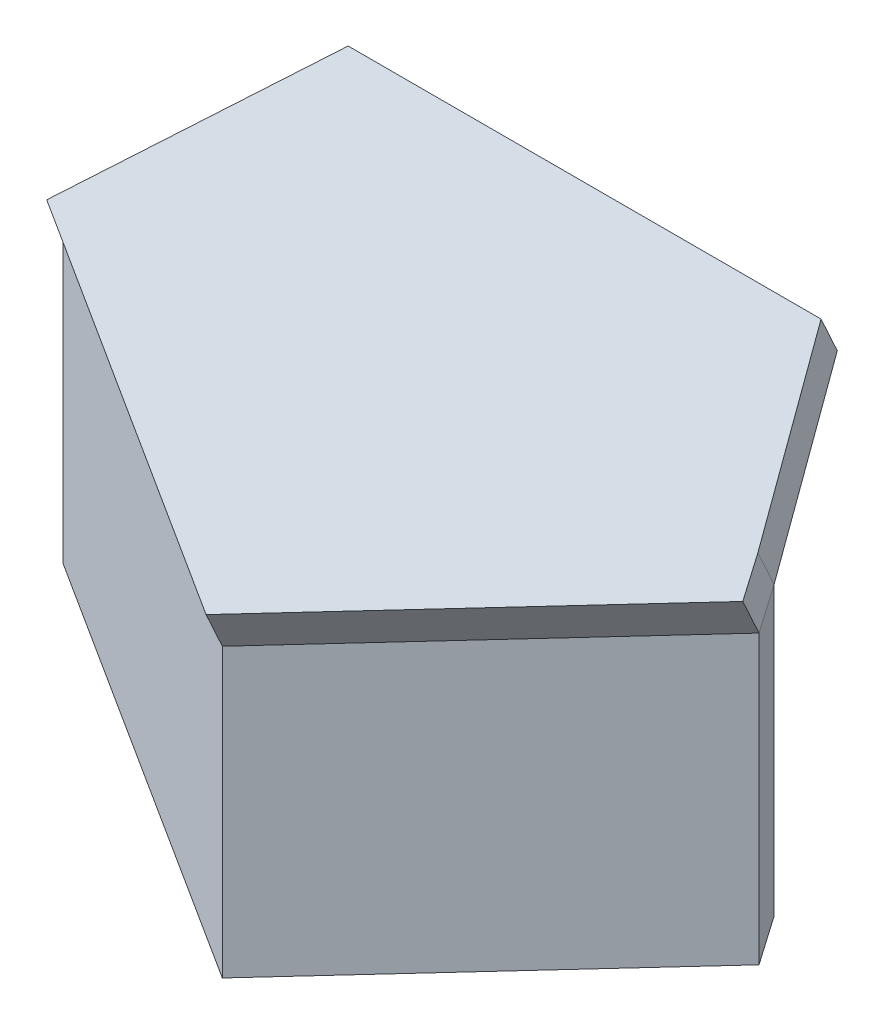
ISO-10303-21;
HEADER;
FILE_DESCRIPTION(('STEP AP214'),'2;1');
FILE_NAME('part.step','',(''),(''),'','','');
FILE_SCHEMA(('AUTOMOTIVE_DESIGN { 1 0 10303 214 1 1 1 1 }'));
ENDSEC;
DATA;
#1=APPLICATION_CONTEXT('core data for automotive mechanical design processes');
#2=APPLICATION_PROTOCOL_DEFINITION('international standard','automotive_design',2000,#1);
#3=PRODUCT_CONTEXT('',#1,'mechanical');
#4=PRODUCT('Part','Part','',(#3));
#5=PRODUCT_RELATED_PRODUCT_CATEGORY('part','',(#4));
#6=PRODUCT_DEFINITION_FORMATION('','',#4);
#7=PRODUCT_DEFINITION_CONTEXT('part definition',#1,'design');
#8=PRODUCT_DEFINITION('design','',#6,#7);
#9=PRODUCT_DEFINITION_SHAPE('','',#8);
#10=(LENGTH_UNIT() NAMED_UNIT(*) SI_UNIT(.MILLI.,.METRE.));
#11=(NAMED_UNIT(*) PLANE_ANGLE_UNIT() SI_UNIT($,.RADIAN.));
#12=(NAMED_UNIT(*) SI_UNIT($,.STERADIAN.) SOLID_ANGLE_UNIT());
#13=UNCERTAINTY_MEASURE_WITH_UNIT(LENGTH_MEASURE(1.E-05),#10,'distance_accuracy_value','');
#14=(GEOMETRIC_REPRESENTATION_CONTEXT(3) GLOBAL_UNCERTAINTY_ASSIGNED_CONTEXT((#13)) GLOBAL_UNIT_ASSIGNED_CONTEXT((#10,
#11,#12)) REPRESENTATION_CONTEXT('',''));
#15=CARTESIAN_POINT('',(0.,0.,0.));
#16=DIRECTION('',(0.,0.,1.));
#17=DIRECTION('',(1.,0.,0.));
#18=AXIS2_PLACEMENT_3D('',#15,#16,#17);
#19=CARTESIAN_POINT('',(4.86882075223607,100.,8.73467712526315));
#20=DIRECTION('',(-0.486882075223607,0.,-0.873467712526315));
#21=DIRECTION('',(-0.873467712526315,0.,0.486882075223607));
#22=AXIS2_PLACEMENT_3D('',#19,#20,#21);
#23=PLANE('',#22);
#24=DIRECTION('',(0.,-1.,0.));
#25=VECTOR('',#24,1.);
#26=CARTESIAN_POINT('',(0.0486636459553036,100.,11.4214943494763));
#27=LINE('',#26,#25);
#28=CARTESIAN_POINT('',(0.0486636459552658,73.5620411776201,11.4214943494763));
#29=VERTEX_POINT('',#28);
#30=CARTESIAN_POINT('',(0.0486636459553036,0.,11.4214943494763));
#31=VERTEX_POINT('',#30);
#32=EDGE_CURVE('E185',#29,#31,#27,.T.);
#33=ORIENTED_EDGE('',*,*,#32,.T.);
#34=DIRECTION('',(0.852663800408745,0.216951466360737,-0.475285708512723));
#35=VECTOR('',#34,1.);
#36=CARTESIAN_POINT('',(23.1406120739026,5.87550693505237,-1.45025306639254));
#37=LINE('',#36,#35);
#38=CARTESIAN_POINT('',(88.285235684222,22.4508812044913,-37.7626995119703));
#39=VERTEX_POINT('',#38);
#40=EDGE_CURVE('E62',#31,#39,#37,.T.);
#41=ORIENTED_EDGE('',*,*,#40,.T.);
#42=DIRECTION('',(0.,-1.,0.));
#43=VECTOR('',#42,1.);
#44=CARTESIAN_POINT('',(88.285235684222,100.,-37.7626995119703));
#45=LINE('',#44,#43);
#46=CARTESIAN_POINT('',(88.285235684222,96.0129223821113,-37.7626995119703));
#47=VERTEX_POINT('',#46);
#48=EDGE_CURVE('E11',#47,#39,#45,.T.);
#49=ORIENTED_EDGE('',*,*,#48,.F.);
#50=DIRECTION('',(-0.852663800408745,-0.216951466360737,0.475285708512723));
#51=VECTOR('',#50,1.);
#52=CARTESIAN_POINT('',(9.53261564042221,75.9751344637524,6.13501820139777));
#53=LINE('',#52,#51);
#54=EDGE_CURVE('E141',#47,#29,#53,.T.);
#55=ORIENTED_EDGE('',*,*,#54,.T.);
#56=EDGE_LOOP('',(#33,#41,#49,#55));
#57=FACE_BOUND('',#56,.T.);
#58=ADVANCED_FACE('F39',(#57),#23,.F.);
#59=CARTESIAN_POINT('',(83.4164149319859,100.,-46.4973766372334));
#60=DIRECTION('',(0.873467712526314,0.,-0.48688207522361));
#61=DIRECTION('',(-0.48688207522361,0.,-0.873467712526314));
#62=AXIS2_PLACEMENT_3D('',#59,#60,#61);
#63=PLANE('',#62);
#64=DIRECTION('',(0.452259904038624,-0.370355663644572,0.811355447140994));
#65=VECTOR('',#64,1.);
#66=CARTESIAN_POINT('',(71.0949924776555,36.5279724392601,-68.6020406491741));
#67=LINE('',#66,#65);
#68=CARTESIAN_POINT('',(83.4164149319859,26.4379588223799,-46.4973766372334));
#69=VERTEX_POINT('',#68);
#70=EDGE_CURVE('E162',#69,#39,#67,.T.);
#71=ORIENTED_EDGE('',*,*,#70,.F.);
#72=DIRECTION('',(0.,-1.,0.));
#73=VECTOR('',#72,1.);
#74=CARTESIAN_POINT('',(83.4164149319859,100.,-46.4973766372334));
#75=LINE('',#74,#73);
#76=CARTESIAN_POINT('',(83.4164149319859,100.,-46.4973766372334));
#77=VERTEX_POINT('',#76);
#78=EDGE_CURVE('E47',#77,#69,#75,.T.);
#79=ORIENTED_EDGE('',*,*,#78,.F.);
#80=DIRECTION('',(-0.452259904038624,0.370355663644572,-0.811355447140994));
#81=VECTOR('',#80,1.);
#82=CARTESIAN_POINT('',(83.4164149319859,100.,-46.4973766372334));
#83=LINE('',#82,#81);
#84=EDGE_CURVE('E180',#47,#77,#83,.T.);
#85=ORIENTED_EDGE('',*,*,#84,.F.);
#86=ORIENTED_EDGE('',*,*,#48,.T.);
#87=EDGE_LOOP('',(#71,#79,#85,#86));
#88=FACE_BOUND('',#87,.T.);
#89=ADVANCED_FACE('F210',(#88),#63,.T.);
#90=CARTESIAN_POINT('',(0.,100.,0.));
#91=DIRECTION('',(-0.486882075223607,0.,-0.873467712526315));
#92=DIRECTION('',(-0.873467712526315,0.,0.486882075223607));
#93=AXIS2_PLACEMENT_3D('',#90,#91,#92);
#94=PLANE('',#93);
#95=DIRECTION('',(0.852663800408745,0.216951466360737,-0.475285708512723));
#96=VECTOR('',#95,1.);
#97=CARTESIAN_POINT('',(17.5342351427504,9.67492102780652,-9.77380694366973));
#98=LINE('',#97,#96);
#99=CARTESIAN_POINT('',(0.,5.21351663382371,0.));
#100=VERTEX_POINT('',#99);
#101=EDGE_CURVE('E159',#100,#69,#98,.T.);
#102=ORIENTED_EDGE('',*,*,#101,.F.);
#103=DIRECTION('',(0.,-1.,0.));
#104=VECTOR('',#103,1.);
#105=CARTESIAN_POINT('',(0.,100.,0.));
#106=LINE('',#105,#104);
#107=CARTESIAN_POINT('',(0.,78.7755578114438,0.));
#108=VERTEX_POINT('',#107);
#109=EDGE_CURVE('E197',#108,#100,#106,.T.);
#110=ORIENTED_EDGE('',*,*,#109,.F.);
#111=DIRECTION('',(-0.852663800408745,-0.216951466360737,0.475285708512723));
#112=VECTOR('',#111,1.);
#113=CARTESIAN_POINT('',(3.92623870926998,79.7745485565066,-2.18853567587941));
#114=LINE('',#113,#112);
#115=EDGE_CURVE('E177',#77,#108,#114,.T.);
#116=ORIENTED_EDGE('',*,*,#115,.F.);
#117=ORIENTED_EDGE('',*,*,#78,.T.);
#118=EDGE_LOOP('',(#102,#110,#116,#117));
#119=FACE_BOUND('',#118,.T.);
#120=ADVANCED_FACE('F206',(#119),#94,.T.);
#121=CARTESIAN_POINT('',(-85.1138419800204,100.,-46.4973766372334));
#122=DIRECTION('',(0.479421352547329,0.,-0.877584848730702));
#123=DIRECTION('',(-0.877584848730703,0.,-0.479421352547329));
#124=AXIS2_PLACEMENT_3D('',#121,#122,#123);
#125=PLANE('',#124);
#126=DIRECTION('',(0.857296678798416,-0.213780078237679,0.468338000454691));
#127=VECTOR('',#126,1.);
#128=CARTESIAN_POINT('',(-98.5957743531129,29.7998854795022,-53.862506359571));
#129=LINE('',#128,#127);
#130=CARTESIAN_POINT('',(-85.1138419800204,26.4379588223799,-46.4973766372334));
#131=VERTEX_POINT('',#130);
#132=EDGE_CURVE('E156',#131,#100,#129,.T.);
#133=ORIENTED_EDGE('',*,*,#132,.F.);
#134=DIRECTION('',(0.,-1.,0.));
#135=VECTOR('',#134,1.);
#136=CARTESIAN_POINT('',(-85.1138419800204,100.,-46.4973766372334));
#137=LINE('',#136,#135);
#138=CARTESIAN_POINT('',(-85.1138419800204,100.,-46.4973766372334));
#139=VERTEX_POINT('',#138);
#140=EDGE_CURVE('E193',#139,#131,#137,.T.);
#141=ORIENTED_EDGE('',*,*,#140,.F.);
#142=DIRECTION('',(-0.857296678798416,0.213780078237679,-0.468338000454691));
#143=VECTOR('',#142,1.);
#144=CARTESIAN_POINT('',(-85.1138419800204,100.,-46.4973766372334));
#145=LINE('',#144,#143);
#146=EDGE_CURVE('E174',#108,#139,#145,.T.);
#147=ORIENTED_EDGE('',*,*,#146,.F.);
#148=ORIENTED_EDGE('',*,*,#109,.T.);
#149=EDGE_LOOP('',(#133,#141,#147,#148));
#150=FACE_BOUND('',#149,.T.);
#151=ADVANCED_FACE('F226',(#150),#125,.T.);
#152=CARTESIAN_POINT('',(-89.9080555054937,100.,-37.7215281499264));
#153=DIRECTION('',(-0.877584848730703,0.,-0.479421352547328));
#154=DIRECTION('',(-0.479421352547328,0.,0.877584848730703));
#155=AXIS2_PLACEMENT_3D('',#152,#153,#154);
#156=PLANE('',#155);
#157=DIRECTION('',(0.445041397347118,0.371860448402883,-0.814652049381165));
#158=VECTOR('',#157,1.);
#159=CARTESIAN_POINT('',(-77.0710862568843,33.1581937655295,-61.2197091473808));
#160=LINE('',#159,#158);
#161=CARTESIAN_POINT('',(-89.9080555054937,22.4320879035199,-37.7215281499264));
#162=VERTEX_POINT('',#161);
#163=EDGE_CURVE('E148',#162,#131,#160,.T.);
#164=ORIENTED_EDGE('',*,*,#163,.F.);
#165=DIRECTION('',(0.,-1.,0.));
#166=VECTOR('',#165,1.);
#167=CARTESIAN_POINT('',(-89.9080555054937,100.,-37.7215281499264));
#168=LINE('',#167,#166);
#169=CARTESIAN_POINT('',(-89.9080555054937,95.9941290811399,-37.7215281499264));
#170=VERTEX_POINT('',#169);
#171=EDGE_CURVE('E189',#170,#162,#168,.T.);
#172=ORIENTED_EDGE('',*,*,#171,.F.);
#173=DIRECTION('',(-0.445041397347118,-0.371860448402883,0.814652049381165));
#174=VECTOR('',#173,1.);
#175=CARTESIAN_POINT('',(-89.2451107334938,96.5480616852791,-38.9350541732481));
#176=LINE('',#175,#174);
#177=EDGE_CURVE('E171',#139,#170,#176,.T.);
#178=ORIENTED_EDGE('',*,*,#177,.F.);
#179=ORIENTED_EDGE('',*,*,#140,.T.);
#180=EDGE_LOOP('',(#164,#172,#178,#179));
#181=FACE_BOUND('',#180,.T.);
#182=ADVANCED_FACE('F221',(#181),#156,.T.);
#183=CARTESIAN_POINT('',(-89.9080555054937,100.,-37.7215281499264));
#184=DIRECTION('',(0.479421352547329,0.,-0.877584848730702));
#185=DIRECTION('',(-0.877584848730703,0.,-0.479421352547329));
#186=AXIS2_PLACEMENT_3D('',#183,#184,#185);
#187=PLANE('',#186);
#188=ORIENTED_EDGE('',*,*,#171,.T.);
#189=DIRECTION('',(0.857296678798416,-0.213780078237679,0.468338000454691));
#190=VECTOR('',#189,1.);
#191=CARTESIAN_POINT('',(-104.124155663477,25.9770905603223,-45.4877310140098));
#192=LINE('',#191,#190);
#193=EDGE_CURVE('E144',#162,#31,#192,.T.);
#194=ORIENTED_EDGE('',*,*,#193,.T.);
#195=ORIENTED_EDGE('',*,*,#32,.F.);
#196=DIRECTION('',(-0.857296678798416,0.213780078237679,-0.468338000454691));
#197=VECTOR('',#196,1.);
#198=CARTESIAN_POINT('',(-90.6422232903843,96.1772050808201,-38.1226012916722));
#199=LINE('',#198,#197);
#200=EDGE_CURVE('E167',#29,#170,#199,.T.);
#201=ORIENTED_EDGE('',*,*,#200,.T.);
#202=EDGE_LOOP('',(#188,#194,#195,#201));
#203=FACE_BOUND('',#202,.T.);
#204=ADVANCED_FACE('F216',(#203),#187,.F.);
#205=CARTESIAN_POINT('',(-89.9080555054937,0.,11.4214943494763));
#206=DIRECTION('',(0.,0.909707375853676,0.415249913085384));
#207=DIRECTION('',(0.,-0.415249913085384,0.909707375853676));
#208=AXIS2_PLACEMENT_3D('',#205,#206,#207);
#209=PLANE('',#208);
#210=ORIENTED_EDGE('',*,*,#193,.F.);
#211=ORIENTED_EDGE('',*,*,#163,.T.);
#212=ORIENTED_EDGE('',*,*,#132,.T.);
#213=ORIENTED_EDGE('',*,*,#101,.T.);
#214=ORIENTED_EDGE('',*,*,#70,.T.);
#215=ORIENTED_EDGE('',*,*,#40,.F.);
#216=EDGE_LOOP('',(#210,#211,#212,#213,#214,#215));
#217=FACE_BOUND('',#216,.T.);
#218=ADVANCED_FACE('F212',(#217),#209,.F.);
#219=CARTESIAN_POINT('',(88.285235684222,105.109996140648,-33.6102003811164));
#220=DIRECTION('',(-0.522459992221907,0.354068569010784,-0.775674548355262));
#221=DIRECTION('',(-0.829403767846431,0.,0.558649612800496));
#222=AXIS2_PLACEMENT_3D('',#219,#220,#221);
#223=PLANE('',#222);
#224=ORIENTED_EDGE('',*,*,#54,.F.);
#225=DIRECTION('',(0.,-0.909707375853676,-0.415249913085384));
#226=VECTOR('',#225,1.);
#227=CARTESIAN_POINT('',(88.285235684222,105.109996140648,-33.6102003811164));
#228=LINE('',#227,#226);
#229=CARTESIAN_POINT('',(88.285235684222,105.109996140648,-33.6102003811164));
#230=VERTEX_POINT('',#229);
#231=EDGE_CURVE('E120',#230,#47,#228,.T.);
#232=ORIENTED_EDGE('',*,*,#231,.F.);
#233=DIRECTION('',(0.852663800408745,0.216951466360737,-0.475285708512723));
#234=VECTOR('',#233,1.);
#235=CARTESIAN_POINT('',(88.285235684222,105.109996140648,-33.6102003811164));
#236=LINE('',#235,#234);
#237=CARTESIAN_POINT('',(0.0486636459552658,82.6591149361568,15.5739934803302));
#238=VERTEX_POINT('',#237);
#239=EDGE_CURVE('E128',#238,#230,#236,.T.);
#240=ORIENTED_EDGE('',*,*,#239,.F.);
#241=DIRECTION('',(0.,-0.909707375853676,-0.415249913085384));
#242=VECTOR('',#241,1.);
#243=CARTESIAN_POINT('',(0.0486636459552658,82.6591149361568,15.5739934803302));
#244=LINE('',#243,#242);
#245=EDGE_CURVE('E247',#238,#29,#244,.T.);
#246=ORIENTED_EDGE('',*,*,#245,.T.);
#247=EDGE_LOOP('',(#224,#232,#240,#246));
#248=FACE_BOUND('',#247,.T.);
#249=ADVANCED_FACE('F139',(#248),#223,.F.);
#250=CARTESIAN_POINT('',(88.285235684222,105.109996140648,-33.6102003811164));
#251=DIRECTION('',(-0.891886191842306,-0.187800885844044,0.411424170506816));
#252=DIRECTION('',(0.418877202150689,0.,0.908042889691016));
#253=AXIS2_PLACEMENT_3D('',#250,#251,#252);
#254=PLANE('',#253);
#255=ORIENTED_EDGE('',*,*,#84,.T.);
#256=DIRECTION('',(0.,-0.909707375853676,-0.415249913085384));
#257=VECTOR('',#256,1.);
#258=CARTESIAN_POINT('',(83.4164149319859,109.097073758537,-42.3448775063796));
#259=LINE('',#258,#257);
#260=CARTESIAN_POINT('',(83.4164149319859,109.097073758537,-42.3448775063796));
#261=VERTEX_POINT('',#260);
#262=EDGE_CURVE('E123',#261,#77,#259,.T.);
#263=ORIENTED_EDGE('',*,*,#262,.F.);
#264=DIRECTION('',(-0.452259904038628,0.370355663644571,-0.811355447140993));
#265=VECTOR('',#264,1.);
#266=CARTESIAN_POINT('',(88.285235684222,105.109996140648,-33.6102003811164));
#267=LINE('',#266,#265);
#268=EDGE_CURVE('E116',#230,#261,#267,.T.);
#269=ORIENTED_EDGE('',*,*,#268,.F.);
#270=ORIENTED_EDGE('',*,*,#231,.T.);
#271=EDGE_LOOP('',(#255,#263,#269,#270));
#272=FACE_BOUND('',#271,.T.);
#273=ADVANCED_FACE('F118',(#272),#254,.F.);
#274=CARTESIAN_POINT('',(83.4164149319859,109.097073758537,-42.3448775063796));
#275=DIRECTION('',(-0.875493036042609,-0.200661520963404,0.439598564426168));
#276=DIRECTION('',(0.448725354516498,0.,0.89366971315696));
#277=AXIS2_PLACEMENT_3D('',#274,#275,#276);
#278=PLANE('',#277);
#279=DIRECTION('',(-0.483230735612807,0.363548407123552,-0.79644247239649));
#280=VECTOR('',#279,1.);
#281=CARTESIAN_POINT('',(83.4164149319859,100.,-46.4973766372334));
#282=LINE('',#281,#280);
#283=CARTESIAN_POINT('',(58.4560224254659,118.778422538493,-87.6361438033356));
#284=VERTEX_POINT('',#283);
#285=EDGE_CURVE('E243',#77,#284,#282,.T.);
#286=ORIENTED_EDGE('',*,*,#285,.T.);
#287=DIRECTION('',(0.,-0.909707375853676,-0.415249913085384));
#288=VECTOR('',#287,1.);
#289=CARTESIAN_POINT('',(58.4560224254659,127.875496297029,-83.4836446724818));
#290=LINE('',#289,#288);
#291=CARTESIAN_POINT('',(58.4560224254659,127.875496297029,-83.4836446724818));
#292=VERTEX_POINT('',#291);
#293=EDGE_CURVE('E150',#292,#284,#290,.T.);
#294=ORIENTED_EDGE('',*,*,#293,.F.);
#295=DIRECTION('',(-0.483230735612807,0.363548407123552,-0.79644247239649));
#296=VECTOR('',#295,1.);
#297=CARTESIAN_POINT('',(83.4164149319859,109.097073758537,-42.3448775063796));
#298=LINE('',#297,#296);
#299=EDGE_CURVE('E127',#261,#292,#298,.T.);
#300=ORIENTED_EDGE('',*,*,#299,.F.);
#301=ORIENTED_EDGE('',*,*,#262,.T.);
#302=EDGE_LOOP('',(#286,#294,#300,#301));
#303=FACE_BOUND('',#302,.T.);
#304=ADVANCED_FACE('F271',(#303),#278,.F.);
#305=CARTESIAN_POINT('',(58.4560224254659,127.875496297029,-83.4836446724818));
#306=DIRECTION('',(0.,-0.415249913085384,0.909707375853676));
#307=DIRECTION('',(0.,-0.909707375853676,-0.415249913085384));
#308=AXIS2_PLACEMENT_3D('',#305,#306,#307);
#309=PLANE('',#308);
#310=DIRECTION('',(-1.,0.,0.));
#311=VECTOR('',#310,1.);
#312=CARTESIAN_POINT('',(58.4560224254659,118.778422538493,-87.6361438033356));
#313=LINE('',#312,#311);
#314=CARTESIAN_POINT('',(-62.639885842983,118.778422538493,-87.6361438033356));
#315=VERTEX_POINT('',#314);
#316=EDGE_CURVE('E240',#284,#315,#313,.T.);
#317=ORIENTED_EDGE('',*,*,#316,.T.);
#318=DIRECTION('',(0.,-0.909707375853676,-0.415249913085384));
#319=VECTOR('',#318,1.);
#320=CARTESIAN_POINT('',(-62.639885842983,127.875496297029,-83.4836446724818));
#321=LINE('',#320,#319);
#322=CARTESIAN_POINT('',(-62.639885842983,127.875496297029,-83.4836446724818));
#323=VERTEX_POINT('',#322);
#324=EDGE_CURVE('E238',#323,#315,#321,.T.);
#325=ORIENTED_EDGE('',*,*,#324,.F.);
#326=DIRECTION('',(-1.,0.,0.));
#327=VECTOR('',#326,1.);
#328=CARTESIAN_POINT('',(58.4560224254659,127.875496297029,-83.4836446724818));
#329=LINE('',#328,#327);
#330=EDGE_CURVE('E259',#292,#323,#329,.T.);
#331=ORIENTED_EDGE('',*,*,#330,.F.);
#332=ORIENTED_EDGE('',*,*,#293,.T.);
#333=EDGE_LOOP('',(#317,#325,#331,#332));
#334=FACE_BOUND('',#333,.T.);
#335=ADVANCED_FACE('F258',(#334),#309,.F.);
#336=CARTESIAN_POINT('',(-85.1138419800204,109.097073758537,-42.3448775063796));
#337=DIRECTION('',(0.895509996955547,-0.184803401567788,0.4048574417269));
#338=DIRECTION('',(0.411953124256226,0.,-0.911205039173694));
#339=AXIS2_PLACEMENT_3D('',#336,#337,#338);
#340=PLANE('',#339);
#341=DIRECTION('',(-0.445041397347118,-0.371860448402882,0.814652049381165));
#342=VECTOR('',#341,1.);
#343=CARTESIAN_POINT('',(-85.1138419800204,100.,-46.4973766372334));
#344=LINE('',#343,#342);
#345=EDGE_CURVE('E137',#315,#139,#344,.T.);
#346=ORIENTED_EDGE('',*,*,#345,.T.);
#347=ORIENTED_EDGE('',*,*,#177,.T.);
#348=DIRECTION('',(0.,-0.909707375853676,-0.415249913085384));
#349=VECTOR('',#348,1.);
#350=CARTESIAN_POINT('',(-89.9080555054937,105.091202839677,-33.5690290190726));
#351=LINE('',#350,#349);
#352=CARTESIAN_POINT('',(-89.9080555054937,105.091202839677,-33.5690290190726));
#353=VERTEX_POINT('',#352);
#354=EDGE_CURVE('E54',#353,#170,#351,.T.);
#355=ORIENTED_EDGE('',*,*,#354,.F.);
#356=DIRECTION('',(-0.445041397347118,-0.371860448402883,0.814652049381164));
#357=VECTOR('',#356,1.);
#358=CARTESIAN_POINT('',(-85.1138419800204,109.097073758537,-42.3448775063796));
#359=LINE('',#358,#357);
#360=EDGE_CURVE('E265',#323,#353,#359,.T.);
#361=ORIENTED_EDGE('',*,*,#360,.F.);
#362=ORIENTED_EDGE('',*,*,#324,.T.);
#363=EDGE_LOOP('',(#346,#347,#355,#361,#362));
#364=FACE_BOUND('',#363,.T.);
#365=ADVANCED_FACE('F235',(#364),#340,.F.);
#366=CARTESIAN_POINT('',(0.0486636459552658,82.6591149361568,15.5739934803302));
#367=DIRECTION('',(0.514822692313777,0.35599237135943,-0.779889111997779));
#368=DIRECTION('',(-0.834562234453546,0.,-0.550913674566084));
#369=AXIS2_PLACEMENT_3D('',#366,#367,#368);
#370=PLANE('',#369);
#371=ORIENTED_EDGE('',*,*,#200,.F.);
#372=ORIENTED_EDGE('',*,*,#245,.F.);
#373=DIRECTION('',(0.857296678798416,-0.213780078237679,0.468338000454691));
#374=VECTOR('',#373,1.);
#375=CARTESIAN_POINT('',(0.0486636459552658,82.6591149361568,15.5739934803302));
#376=LINE('',#375,#374);
#377=EDGE_CURVE('E132',#353,#238,#376,.T.);
#378=ORIENTED_EDGE('',*,*,#377,.F.);
#379=ORIENTED_EDGE('',*,*,#354,.T.);
#380=EDGE_LOOP('',(#371,#372,#378,#379));
#381=FACE_BOUND('',#380,.T.);
#382=ADVANCED_FACE('F327',(#381),#370,.F.);
#383=CARTESIAN_POINT('',(0.,74.2891659604095,33.9104315597059));
#384=DIRECTION('',(0.,-0.909707375853676,-0.415249913085384));
#385=DIRECTION('',(0.,0.415249913085384,-0.909707375853676));
#386=AXIS2_PLACEMENT_3D('',#383,#384,#385);
#387=PLANE('',#386);
#388=ORIENTED_EDGE('',*,*,#239,.T.);
#389=ORIENTED_EDGE('',*,*,#268,.T.);
#390=ORIENTED_EDGE('',*,*,#299,.T.);
#391=ORIENTED_EDGE('',*,*,#330,.T.);
#392=ORIENTED_EDGE('',*,*,#360,.T.);
#393=ORIENTED_EDGE('',*,*,#377,.T.);
#394=EDGE_LOOP('',(#388,#389,#390,#391,#392,#393));
#395=FACE_BOUND('',#394,.T.);
#396=ADVANCED_FACE('F131',(#395),#387,.F.);
#397=CARTESIAN_POINT('',(0.,65.1920922018728,29.757932428852));
#398=DIRECTION('',(0.,-0.909707375853676,-0.415249913085384));
#399=DIRECTION('',(0.,0.415249913085384,-0.909707375853676));
#400=AXIS2_PLACEMENT_3D('',#397,#398,#399);
#401=PLANE('',#400);
#402=ORIENTED_EDGE('',*,*,#285,.F.);
#403=ORIENTED_EDGE('',*,*,#115,.T.);
#404=ORIENTED_EDGE('',*,*,#146,.T.);
#405=ORIENTED_EDGE('',*,*,#345,.F.);
#406=ORIENTED_EDGE('',*,*,#316,.F.);
#407=EDGE_LOOP('',(#402,#403,#404,#405,#406));
#408=FACE_BOUND('',#407,.T.);
#409=ADVANCED_FACE('F230',(#408),#401,.T.);
#410=CLOSED_SHELL('',(#58,#89,#120,#151,#182,#204,#218,#249,#273,#304,#335,#365,#382,#396,#409));
#411=MANIFOLD_SOLID_BREP('B2',#410);
#412=ADVANCED_BREP_SHAPE_REPRESENTATION('',(#18,#411),#14);
#413=SHAPE_DEFINITION_REPRESENTATION(#9,#412);
ENDSEC;
END-ISO-10303-21;
